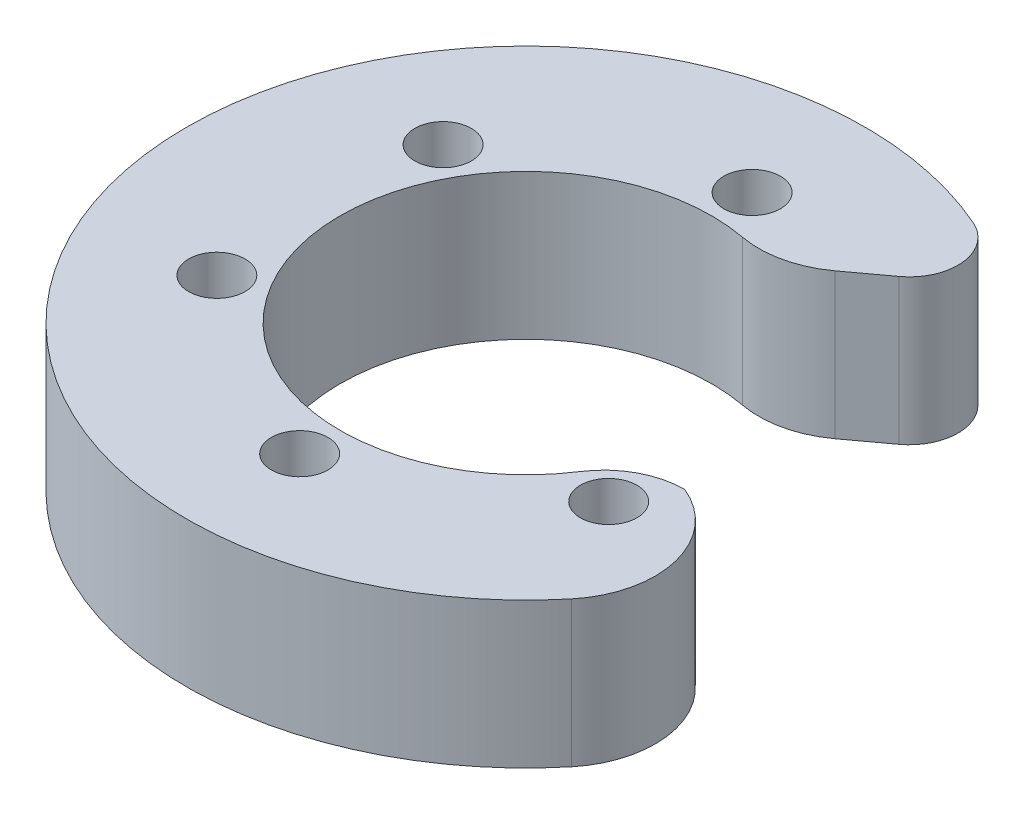
ISO-10303-21;
HEADER;
FILE_DESCRIPTION(('STEP AP214'),'2;1');
FILE_NAME('part.step','',(''),(''),'','','');
FILE_SCHEMA(('AUTOMOTIVE_DESIGN { 1 0 10303 214 1 1 1 1 }'));
ENDSEC;
DATA;
#1=APPLICATION_CONTEXT('core data for automotive mechanical design processes');
#2=APPLICATION_PROTOCOL_DEFINITION('international standard','automotive_design',2000,#1);
#3=PRODUCT_CONTEXT('',#1,'mechanical');
#4=PRODUCT('Part','Part','',(#3));
#5=PRODUCT_RELATED_PRODUCT_CATEGORY('part','',(#4));
#6=PRODUCT_DEFINITION_FORMATION('','',#4);
#7=PRODUCT_DEFINITION_CONTEXT('part definition',#1,'design');
#8=PRODUCT_DEFINITION('design','',#6,#7);
#9=PRODUCT_DEFINITION_SHAPE('','',#8);
#10=(LENGTH_UNIT() NAMED_UNIT(*) SI_UNIT(.MILLI.,.METRE.));
#11=(NAMED_UNIT(*) PLANE_ANGLE_UNIT() SI_UNIT($,.RADIAN.));
#12=(NAMED_UNIT(*) SI_UNIT($,.STERADIAN.) SOLID_ANGLE_UNIT());
#13=UNCERTAINTY_MEASURE_WITH_UNIT(LENGTH_MEASURE(1.E-05),#10,'distance_accuracy_value','');
#14=(GEOMETRIC_REPRESENTATION_CONTEXT(3) GLOBAL_UNCERTAINTY_ASSIGNED_CONTEXT((#13)) GLOBAL_UNIT_ASSIGNED_CONTEXT((#10,
#11,#12)) REPRESENTATION_CONTEXT('',''));
#15=CARTESIAN_POINT('',(0.,0.,0.));
#16=DIRECTION('',(0.,0.,1.));
#17=DIRECTION('',(1.,0.,0.));
#18=AXIS2_PLACEMENT_3D('',#15,#16,#17);
#19=CARTESIAN_POINT('',(0.,9.,0.));
#20=DIRECTION('',(0.,-1.,0.));
#21=DIRECTION('',(0.,0.,-1.));
#22=AXIS2_PLACEMENT_3D('',#19,#20,#21);
#23=CYLINDRICAL_SURFACE('',#22,21.);
#24=CARTESIAN_POINT('',(0.,9.,0.));
#25=DIRECTION('',(0.,1.,0.));
#26=DIRECTION('',(0.,0.,1.));
#27=AXIS2_PLACEMENT_3D('',#24,#25,#26);
#28=CIRCLE('',#27,21.);
#29=CARTESIAN_POINT('',(8.48239935681578,9.,-19.2106455162624));
#30=VERTEX_POINT('',#29);
#31=CARTESIAN_POINT('',(16.1877045990728,9.,13.3775266702466));
#32=VERTEX_POINT('',#31);
#33=EDGE_CURVE('E121',#30,#32,#28,.T.);
#34=ORIENTED_EDGE('',*,*,#33,.F.);
#35=DIRECTION('',(0.,-1.,0.));
#36=VECTOR('',#35,1.);
#37=CARTESIAN_POINT('',(8.48239935681579,9.,-19.2106455162624));
#38=LINE('',#37,#36);
#39=CARTESIAN_POINT('',(8.48239935681578,0.,-19.2106455162624));
#40=VERTEX_POINT('',#39);
#41=EDGE_CURVE('E142',#30,#40,#38,.T.);
#42=ORIENTED_EDGE('',*,*,#41,.T.);
#43=CARTESIAN_POINT('',(0.,0.,0.));
#44=DIRECTION('',(0.,1.,0.));
#45=DIRECTION('',(0.,0.,1.));
#46=AXIS2_PLACEMENT_3D('',#43,#44,#45);
#47=CIRCLE('',#46,21.);
#48=CARTESIAN_POINT('',(16.1877045990728,0.,13.3775266702466));
#49=VERTEX_POINT('',#48);
#50=EDGE_CURVE('E124',#40,#49,#47,.T.);
#51=ORIENTED_EDGE('',*,*,#50,.T.);
#52=DIRECTION('',(0.,-1.,0.));
#53=VECTOR('',#52,1.);
#54=CARTESIAN_POINT('',(16.1877045990728,9.,13.3775266702466));
#55=LINE('',#54,#53);
#56=EDGE_CURVE('E105',#49,#32,#55,.F.);
#57=ORIENTED_EDGE('',*,*,#56,.T.);
#58=EDGE_LOOP('',(#34,#42,#51,#57));
#59=FACE_BOUND('',#58,.T.);
#60=ADVANCED_FACE('F39',(#59),#23,.T.);
#61=CARTESIAN_POINT('',(0.,9.,0.));
#62=DIRECTION('',(0.,1.,0.));
#63=DIRECTION('',(0.,0.,1.));
#64=AXIS2_PLACEMENT_3D('',#61,#62,#63);
#65=PLANE('',#64);
#66=DIRECTION('',(-0.805020921117252,0.,0.593246421450253));
#67=VECTOR('',#66,1.);
#68=CARTESIAN_POINT('',(-3.52531693439974,9.,-4.78376907663943));
#69=LINE('',#68,#67);
#70=CARTESIAN_POINT('',(9.05036728447858,9.,-14.051204822016));
#71=VERTEX_POINT('',#70);
#72=CARTESIAN_POINT('',(6.77230426460696,9.,-12.3724251792443));
#73=VERTEX_POINT('',#72);
#74=EDGE_CURVE('E186',#71,#73,#69,.T.);
#75=ORIENTED_EDGE('',*,*,#74,.F.);
#76=CARTESIAN_POINT('',(7.27062802012782,9.,-16.4662675853677));
#77=DIRECTION('',(0.,1.,0.));
#78=DIRECTION('',(0.,0.,1.));
#79=AXIS2_PLACEMENT_3D('',#76,#77,#78);
#80=CIRCLE('',#79,3.);
#81=EDGE_CURVE('E11',#71,#30,#80,.T.);
#82=ORIENTED_EDGE('',*,*,#81,.T.);
#83=ORIENTED_EDGE('',*,*,#33,.T.);
#84=CARTESIAN_POINT('',(11.5626461421948,9.,9.55537619303328));
#85=DIRECTION('',(0.,1.,0.));
#86=DIRECTION('',(0.,0.,1.));
#87=AXIS2_PLACEMENT_3D('',#84,#85,#86);
#88=CIRCLE('',#87,6.);
#89=CARTESIAN_POINT('',(13.8293166859393,9.,4.));
#90=VERTEX_POINT('',#89);
#91=EDGE_CURVE('E130',#32,#90,#88,.T.);
#92=ORIENTED_EDGE('',*,*,#91,.T.);
#93=CARTESIAN_POINT('',(13.8293166859393,9.,9.));
#94=DIRECTION('',(0.,1.,0.));
#95=DIRECTION('',(0.,0.,1.));
#96=AXIS2_PLACEMENT_3D('',#93,#94,#95);
#97=CIRCLE('',#96,5.);
#98=CARTESIAN_POINT('',(9.63861465989712,9.,6.27272727272728));
#99=VERTEX_POINT('',#98);
#100=EDGE_CURVE('E120',#90,#99,#97,.T.);
#101=ORIENTED_EDGE('',*,*,#100,.T.);
#102=CARTESIAN_POINT('',(0.,9.,0.));
#103=DIRECTION('',(0.,1.,0.));
#104=DIRECTION('',(0.,0.,1.));
#105=AXIS2_PLACEMENT_3D('',#102,#103,#104);
#106=CIRCLE('',#105,11.5);
#107=CARTESIAN_POINT('',(2.11128548359501,9.,-11.3045333210514));
#108=VERTEX_POINT('',#107);
#109=EDGE_CURVE('E184',#108,#99,#106,.T.);
#110=ORIENTED_EDGE('',*,*,#109,.F.);
#111=CARTESIAN_POINT('',(3.21282573590544,9.,-17.2025507059478));
#112=DIRECTION('',(0.,1.,0.));
#113=DIRECTION('',(0.,0.,1.));
#114=AXIS2_PLACEMENT_3D('',#111,#112,#113);
#115=CIRCLE('',#114,6.);
#116=EDGE_CURVE('E135',#108,#73,#115,.T.);
#117=ORIENTED_EDGE('',*,*,#116,.T.);
#118=EDGE_LOOP('',(#75,#82,#83,#92,#101,#110,#117));
#119=FACE_BOUND('',#118,.T.);
#120=CARTESIAN_POINT('',(12.1243556529822,9.,6.99999999999989));
#121=DIRECTION('',(0.,1.,0.));
#122=DIRECTION('',(0.,0.,1.));
#123=AXIS2_PLACEMENT_3D('',#120,#121,#122);
#124=CIRCLE('',#123,1.75000000000001);
#125=CARTESIAN_POINT('',(12.1243556529822,9.,8.7499999999999));
#126=VERTEX_POINT('',#125);
#127=EDGE_CURVE('E180',#126,#126,#124,.T.);
#128=ORIENTED_EDGE('',*,*,#127,.F.);
#129=EDGE_LOOP('',(#128));
#130=FACE_BOUND('',#129,.T.);
#131=CARTESIAN_POINT('',(0.,9.,14.));
#132=DIRECTION('',(0.,1.,0.));
#133=DIRECTION('',(0.,0.,1.));
#134=AXIS2_PLACEMENT_3D('',#131,#132,#133);
#135=CIRCLE('',#134,1.75000000000001);
#136=CARTESIAN_POINT('',(0.,9.,15.75));
#137=VERTEX_POINT('',#136);
#138=EDGE_CURVE('E174',#137,#137,#135,.T.);
#139=ORIENTED_EDGE('',*,*,#138,.F.);
#140=EDGE_LOOP('',(#139));
#141=FACE_BOUND('',#140,.T.);
#142=CARTESIAN_POINT('',(-12.1243556529821,9.,7.00000000000006));
#143=DIRECTION('',(0.,1.,0.));
#144=DIRECTION('',(0.,0.,1.));
#145=AXIS2_PLACEMENT_3D('',#142,#143,#144);
#146=CIRCLE('',#145,1.75000000000001);
#147=CARTESIAN_POINT('',(-12.1243556529821,9.,8.75000000000007));
#148=VERTEX_POINT('',#147);
#149=EDGE_CURVE('E168',#148,#148,#146,.T.);
#150=ORIENTED_EDGE('',*,*,#149,.F.);
#151=EDGE_LOOP('',(#150));
#152=FACE_BOUND('',#151,.T.);
#153=CARTESIAN_POINT('',(-12.1243556529822,9.,-6.99999999999997));
#154=DIRECTION('',(0.,1.,0.));
#155=DIRECTION('',(0.,0.,1.));
#156=AXIS2_PLACEMENT_3D('',#153,#154,#155);
#157=CIRCLE('',#156,1.75000000000001);
#158=CARTESIAN_POINT('',(-12.1243556529822,9.,-5.24999999999996));
#159=VERTEX_POINT('',#158);
#160=EDGE_CURVE('E162',#159,#159,#157,.T.);
#161=ORIENTED_EDGE('',*,*,#160,.F.);
#162=EDGE_LOOP('',(#161));
#163=FACE_BOUND('',#162,.T.);
#164=CARTESIAN_POINT('',(0.,9.,-14.));
#165=DIRECTION('',(0.,1.,0.));
#166=DIRECTION('',(0.,0.,1.));
#167=AXIS2_PLACEMENT_3D('',#164,#165,#166);
#168=CIRCLE('',#167,1.75000000000001);
#169=CARTESIAN_POINT('',(0.,9.,-12.25));
#170=VERTEX_POINT('',#169);
#171=EDGE_CURVE('E152',#170,#170,#168,.T.);
#172=ORIENTED_EDGE('',*,*,#171,.F.);
#173=EDGE_LOOP('',(#172));
#174=FACE_BOUND('',#173,.T.);
#175=ADVANCED_FACE('F193',(#119,#130,#141,#152,#163,#174),#65,.T.);
#176=CARTESIAN_POINT('',(0.,0.,0.));
#177=DIRECTION('',(0.,1.,0.));
#178=DIRECTION('',(0.,0.,1.));
#179=AXIS2_PLACEMENT_3D('',#176,#177,#178);
#180=PLANE('',#179);
#181=CARTESIAN_POINT('',(0.,0.,-14.));
#182=DIRECTION('',(0.,1.,0.));
#183=DIRECTION('',(0.,0.,1.));
#184=AXIS2_PLACEMENT_3D('',#181,#182,#183);
#185=CIRCLE('',#184,1.75000000000001);
#186=CARTESIAN_POINT('',(0.,0.,-12.25));
#187=VERTEX_POINT('',#186);
#188=EDGE_CURVE('E150',#187,#187,#185,.T.);
#189=ORIENTED_EDGE('',*,*,#188,.T.);
#190=EDGE_LOOP('',(#189));
#191=FACE_BOUND('',#190,.T.);
#192=CARTESIAN_POINT('',(-12.1243556529822,0.,-6.99999999999997));
#193=DIRECTION('',(0.,1.,0.));
#194=DIRECTION('',(0.,0.,1.));
#195=AXIS2_PLACEMENT_3D('',#192,#193,#194);
#196=CIRCLE('',#195,1.75000000000001);
#197=CARTESIAN_POINT('',(-12.1243556529822,0.,-5.24999999999996));
#198=VERTEX_POINT('',#197);
#199=EDGE_CURVE('E157',#198,#198,#196,.T.);
#200=ORIENTED_EDGE('',*,*,#199,.T.);
#201=EDGE_LOOP('',(#200));
#202=FACE_BOUND('',#201,.T.);
#203=CARTESIAN_POINT('',(-12.1243556529821,0.,7.00000000000006));
#204=DIRECTION('',(0.,1.,0.));
#205=DIRECTION('',(0.,0.,1.));
#206=AXIS2_PLACEMENT_3D('',#203,#204,#205);
#207=CIRCLE('',#206,1.75000000000001);
#208=CARTESIAN_POINT('',(-12.1243556529821,0.,8.75000000000007));
#209=VERTEX_POINT('',#208);
#210=EDGE_CURVE('E165',#209,#209,#207,.T.);
#211=ORIENTED_EDGE('',*,*,#210,.T.);
#212=EDGE_LOOP('',(#211));
#213=FACE_BOUND('',#212,.T.);
#214=CARTESIAN_POINT('',(0.,0.,14.));
#215=DIRECTION('',(0.,1.,0.));
#216=DIRECTION('',(0.,0.,1.));
#217=AXIS2_PLACEMENT_3D('',#214,#215,#216);
#218=CIRCLE('',#217,1.75000000000001);
#219=CARTESIAN_POINT('',(0.,0.,15.75));
#220=VERTEX_POINT('',#219);
#221=EDGE_CURVE('E171',#220,#220,#218,.T.);
#222=ORIENTED_EDGE('',*,*,#221,.T.);
#223=EDGE_LOOP('',(#222));
#224=FACE_BOUND('',#223,.T.);
#225=CARTESIAN_POINT('',(12.1243556529822,0.,6.99999999999989));
#226=DIRECTION('',(0.,1.,0.));
#227=DIRECTION('',(0.,0.,1.));
#228=AXIS2_PLACEMENT_3D('',#225,#226,#227);
#229=CIRCLE('',#228,1.75000000000001);
#230=CARTESIAN_POINT('',(12.1243556529822,0.,8.7499999999999));
#231=VERTEX_POINT('',#230);
#232=EDGE_CURVE('E177',#231,#231,#229,.T.);
#233=ORIENTED_EDGE('',*,*,#232,.T.);
#234=EDGE_LOOP('',(#233));
#235=FACE_BOUND('',#234,.T.);
#236=ORIENTED_EDGE('',*,*,#50,.F.);
#237=CARTESIAN_POINT('',(7.27062802012782,0.,-16.4662675853677));
#238=DIRECTION('',(0.,1.,0.));
#239=DIRECTION('',(0.,0.,1.));
#240=AXIS2_PLACEMENT_3D('',#237,#238,#239);
#241=CIRCLE('',#240,3.);
#242=CARTESIAN_POINT('',(9.05036728447858,0.,-14.051204822016));
#243=VERTEX_POINT('',#242);
#244=EDGE_CURVE('E61',#40,#243,#241,.F.);
#245=ORIENTED_EDGE('',*,*,#244,.T.);
#246=DIRECTION('',(0.805020921117252,0.,-0.593246421450253));
#247=VECTOR('',#246,1.);
#248=CARTESIAN_POINT('',(-1.25741602042336,0.,-6.45505992899765));
#249=LINE('',#248,#247);
#250=CARTESIAN_POINT('',(6.77230426460697,0.,-12.3724251792443));
#251=VERTEX_POINT('',#250);
#252=EDGE_CURVE('E188',#251,#243,#249,.T.);
#253=ORIENTED_EDGE('',*,*,#252,.F.);
#254=CARTESIAN_POINT('',(3.21282573590544,0.,-17.2025507059478));
#255=DIRECTION('',(0.,1.,0.));
#256=DIRECTION('',(0.,0.,1.));
#257=AXIS2_PLACEMENT_3D('',#254,#255,#256);
#258=CIRCLE('',#257,6.);
#259=CARTESIAN_POINT('',(2.11128548359501,0.,-11.3045333210514));
#260=VERTEX_POINT('',#259);
#261=EDGE_CURVE('E140',#251,#260,#258,.F.);
#262=ORIENTED_EDGE('',*,*,#261,.T.);
#263=CARTESIAN_POINT('',(0.,0.,0.));
#264=DIRECTION('',(0.,1.,0.));
#265=DIRECTION('',(0.,0.,1.));
#266=AXIS2_PLACEMENT_3D('',#263,#264,#265);
#267=CIRCLE('',#266,11.5);
#268=CARTESIAN_POINT('',(9.63861465989712,0.,6.27272727272728));
#269=VERTEX_POINT('',#268);
#270=EDGE_CURVE('E111',#260,#269,#267,.T.);
#271=ORIENTED_EDGE('',*,*,#270,.T.);
#272=CARTESIAN_POINT('',(13.8293166859393,0.,9.));
#273=DIRECTION('',(0.,1.,0.));
#274=DIRECTION('',(0.,0.,1.));
#275=AXIS2_PLACEMENT_3D('',#272,#273,#274);
#276=CIRCLE('',#275,5.);
#277=CARTESIAN_POINT('',(13.8293166859393,0.,4.));
#278=VERTEX_POINT('',#277);
#279=EDGE_CURVE('E106',#269,#278,#276,.F.);
#280=ORIENTED_EDGE('',*,*,#279,.T.);
#281=CARTESIAN_POINT('',(11.5626461421948,0.,9.55537619303328));
#282=DIRECTION('',(0.,1.,0.));
#283=DIRECTION('',(0.,0.,1.));
#284=AXIS2_PLACEMENT_3D('',#281,#282,#283);
#285=CIRCLE('',#284,6.);
#286=EDGE_CURVE('E98',#278,#49,#285,.F.);
#287=ORIENTED_EDGE('',*,*,#286,.T.);
#288=EDGE_LOOP('',(#236,#245,#253,#262,#271,#280,#287));
#289=FACE_BOUND('',#288,.T.);
#290=ADVANCED_FACE('F109',(#191,#202,#213,#224,#235,#289),#180,.F.);
#291=CARTESIAN_POINT('',(0.,9.,0.));
#292=DIRECTION('',(0.,1.,0.));
#293=DIRECTION('',(0.,0.,1.));
#294=AXIS2_PLACEMENT_3D('',#291,#292,#293);
#295=CYLINDRICAL_SURFACE('',#294,11.5);
#296=ORIENTED_EDGE('',*,*,#270,.F.);
#297=DIRECTION('',(0.,1.,0.));
#298=VECTOR('',#297,1.);
#299=CARTESIAN_POINT('',(2.11128548359501,9.,-11.3045333210514));
#300=LINE('',#299,#298);
#301=EDGE_CURVE('E132',#260,#108,#300,.T.);
#302=ORIENTED_EDGE('',*,*,#301,.T.);
#303=ORIENTED_EDGE('',*,*,#109,.T.);
#304=DIRECTION('',(0.,1.,0.));
#305=VECTOR('',#304,1.);
#306=CARTESIAN_POINT('',(9.63861465989712,9.,6.27272727272728));
#307=LINE('',#306,#305);
#308=EDGE_CURVE('E115',#99,#269,#307,.F.);
#309=ORIENTED_EDGE('',*,*,#308,.T.);
#310=EDGE_LOOP('',(#296,#302,#303,#309));
#311=FACE_BOUND('',#310,.T.);
#312=ADVANCED_FACE('F200',(#311),#295,.F.);
#313=CARTESIAN_POINT('',(0.,9.,-14.));
#314=DIRECTION('',(0.,1.,0.));
#315=DIRECTION('',(0.,0.,1.));
#316=AXIS2_PLACEMENT_3D('',#313,#314,#315);
#317=CYLINDRICAL_SURFACE('',#316,1.75000000000001);
#318=ORIENTED_EDGE('',*,*,#188,.F.);
#319=EDGE_LOOP('',(#318));
#320=FACE_BOUND('',#319,.T.);
#321=ORIENTED_EDGE('',*,*,#171,.T.);
#322=EDGE_LOOP('',(#321));
#323=FACE_BOUND('',#322,.T.);
#324=ADVANCED_FACE('F202',(#320,#323),#317,.F.);
#325=CARTESIAN_POINT('',(-12.1243556529822,9.,-6.99999999999997));
#326=DIRECTION('',(0.,1.,0.));
#327=DIRECTION('',(0.,0.,1.));
#328=AXIS2_PLACEMENT_3D('',#325,#326,#327);
#329=CYLINDRICAL_SURFACE('',#328,1.75000000000001);
#330=ORIENTED_EDGE('',*,*,#199,.F.);
#331=EDGE_LOOP('',(#330));
#332=FACE_BOUND('',#331,.T.);
#333=ORIENTED_EDGE('',*,*,#160,.T.);
#334=EDGE_LOOP('',(#333));
#335=FACE_BOUND('',#334,.T.);
#336=ADVANCED_FACE('F209',(#332,#335),#329,.F.);
#337=CARTESIAN_POINT('',(-12.1243556529821,9.,7.00000000000006));
#338=DIRECTION('',(0.,1.,0.));
#339=DIRECTION('',(0.,0.,1.));
#340=AXIS2_PLACEMENT_3D('',#337,#338,#339);
#341=CYLINDRICAL_SURFACE('',#340,1.75000000000001);
#342=ORIENTED_EDGE('',*,*,#210,.F.);
#343=EDGE_LOOP('',(#342));
#344=FACE_BOUND('',#343,.T.);
#345=ORIENTED_EDGE('',*,*,#149,.T.);
#346=EDGE_LOOP('',(#345));
#347=FACE_BOUND('',#346,.T.);
#348=ADVANCED_FACE('F289',(#344,#347),#341,.F.);
#349=CARTESIAN_POINT('',(0.,9.,14.));
#350=DIRECTION('',(0.,1.,0.));
#351=DIRECTION('',(0.,0.,1.));
#352=AXIS2_PLACEMENT_3D('',#349,#350,#351);
#353=CYLINDRICAL_SURFACE('',#352,1.75000000000001);
#354=ORIENTED_EDGE('',*,*,#221,.F.);
#355=EDGE_LOOP('',(#354));
#356=FACE_BOUND('',#355,.T.);
#357=ORIENTED_EDGE('',*,*,#138,.T.);
#358=EDGE_LOOP('',(#357));
#359=FACE_BOUND('',#358,.T.);
#360=ADVANCED_FACE('F281',(#356,#359),#353,.F.);
#361=CARTESIAN_POINT('',(12.1243556529822,9.,6.99999999999989));
#362=DIRECTION('',(0.,1.,0.));
#363=DIRECTION('',(0.,0.,1.));
#364=AXIS2_PLACEMENT_3D('',#361,#362,#363);
#365=CYLINDRICAL_SURFACE('',#364,1.75000000000001);
#366=ORIENTED_EDGE('',*,*,#232,.F.);
#367=EDGE_LOOP('',(#366));
#368=FACE_BOUND('',#367,.T.);
#369=ORIENTED_EDGE('',*,*,#127,.T.);
#370=EDGE_LOOP('',(#369));
#371=FACE_BOUND('',#370,.T.);
#372=ADVANCED_FACE('F225',(#368,#371),#365,.F.);
#373=CARTESIAN_POINT('',(13.8293166859393,9.,9.));
#374=DIRECTION('',(0.,1.,0.));
#375=DIRECTION('',(0.,0.,1.));
#376=AXIS2_PLACEMENT_3D('',#373,#374,#375);
#377=CYLINDRICAL_SURFACE('',#376,5.);
#378=ORIENTED_EDGE('',*,*,#279,.F.);
#379=ORIENTED_EDGE('',*,*,#308,.F.);
#380=ORIENTED_EDGE('',*,*,#100,.F.);
#381=DIRECTION('',(0.,-1.,0.));
#382=VECTOR('',#381,1.);
#383=CARTESIAN_POINT('',(13.8293166859393,9.,4.));
#384=LINE('',#383,#382);
#385=EDGE_CURVE('E103',#278,#90,#384,.F.);
#386=ORIENTED_EDGE('',*,*,#385,.F.);
#387=EDGE_LOOP('',(#378,#379,#380,#386));
#388=FACE_BOUND('',#387,.T.);
#389=ADVANCED_FACE('F118',(#388),#377,.T.);
#390=CARTESIAN_POINT('',(11.5626461421948,9.,9.55537619303328));
#391=DIRECTION('',(0.,1.,0.));
#392=DIRECTION('',(0.,0.,1.));
#393=AXIS2_PLACEMENT_3D('',#390,#391,#392);
#394=CYLINDRICAL_SURFACE('',#393,6.);
#395=ORIENTED_EDGE('',*,*,#91,.F.);
#396=ORIENTED_EDGE('',*,*,#56,.F.);
#397=ORIENTED_EDGE('',*,*,#286,.F.);
#398=ORIENTED_EDGE('',*,*,#385,.T.);
#399=EDGE_LOOP('',(#395,#396,#397,#398));
#400=FACE_BOUND('',#399,.T.);
#401=ADVANCED_FACE('F101',(#400),#394,.T.);
#402=CARTESIAN_POINT('',(-1.25741602042336,10.,-6.45505992899765));
#403=DIRECTION('',(-0.593246421450253,0.,-0.805020921117252));
#404=DIRECTION('',(-0.805020921117252,0.,0.593246421450253));
#405=AXIS2_PLACEMENT_3D('',#402,#403,#404);
#406=PLANE('',#405);
#407=ORIENTED_EDGE('',*,*,#252,.T.);
#408=DIRECTION('',(0.,-1.,0.));
#409=VECTOR('',#408,1.);
#410=CARTESIAN_POINT('',(9.05036728447858,10.,-14.051204822016));
#411=LINE('',#410,#409);
#412=EDGE_CURVE('E47',#243,#71,#411,.F.);
#413=ORIENTED_EDGE('',*,*,#412,.T.);
#414=ORIENTED_EDGE('',*,*,#74,.T.);
#415=DIRECTION('',(0.,1.,0.));
#416=VECTOR('',#415,1.);
#417=CARTESIAN_POINT('',(6.77230426460696,10.,-12.3724251792443));
#418=LINE('',#417,#416);
#419=EDGE_CURVE('E138',#73,#251,#418,.F.);
#420=ORIENTED_EDGE('',*,*,#419,.T.);
#421=EDGE_LOOP('',(#407,#413,#414,#420));
#422=FACE_BOUND('',#421,.T.);
#423=ADVANCED_FACE('F189',(#422),#406,.F.);
#424=CARTESIAN_POINT('',(3.21282573590544,9.,-17.2025507059478));
#425=DIRECTION('',(0.,1.,0.));
#426=DIRECTION('',(0.,0.,1.));
#427=AXIS2_PLACEMENT_3D('',#424,#425,#426);
#428=CYLINDRICAL_SURFACE('',#427,6.);
#429=ORIENTED_EDGE('',*,*,#261,.F.);
#430=ORIENTED_EDGE('',*,*,#419,.F.);
#431=ORIENTED_EDGE('',*,*,#116,.F.);
#432=ORIENTED_EDGE('',*,*,#301,.F.);
#433=EDGE_LOOP('',(#429,#430,#431,#432));
#434=FACE_BOUND('',#433,.T.);
#435=ADVANCED_FACE('F198',(#434),#428,.T.);
#436=CARTESIAN_POINT('',(7.27062802012782,9.,-16.4662675853677));
#437=DIRECTION('',(0.,-1.,0.));
#438=DIRECTION('',(0.,0.,-1.));
#439=AXIS2_PLACEMENT_3D('',#436,#437,#438);
#440=CYLINDRICAL_SURFACE('',#439,3.);
#441=ORIENTED_EDGE('',*,*,#81,.F.);
#442=ORIENTED_EDGE('',*,*,#412,.F.);
#443=ORIENTED_EDGE('',*,*,#244,.F.);
#444=ORIENTED_EDGE('',*,*,#41,.F.);
#445=EDGE_LOOP('',(#441,#442,#443,#444));
#446=FACE_BOUND('',#445,.T.);
#447=ADVANCED_FACE('F41',(#446),#440,.T.);
#448=CLOSED_SHELL('',(#60,#175,#290,#312,#324,#336,#348,#360,#372,#389,#401,#423,#435,#447));
#449=MANIFOLD_SOLID_BREP('B2',#448);
#450=ADVANCED_BREP_SHAPE_REPRESENTATION('',(#18,#449),#14);
#451=SHAPE_DEFINITION_REPRESENTATION(#9,#450);
ENDSEC;
END-ISO-10303-21;
